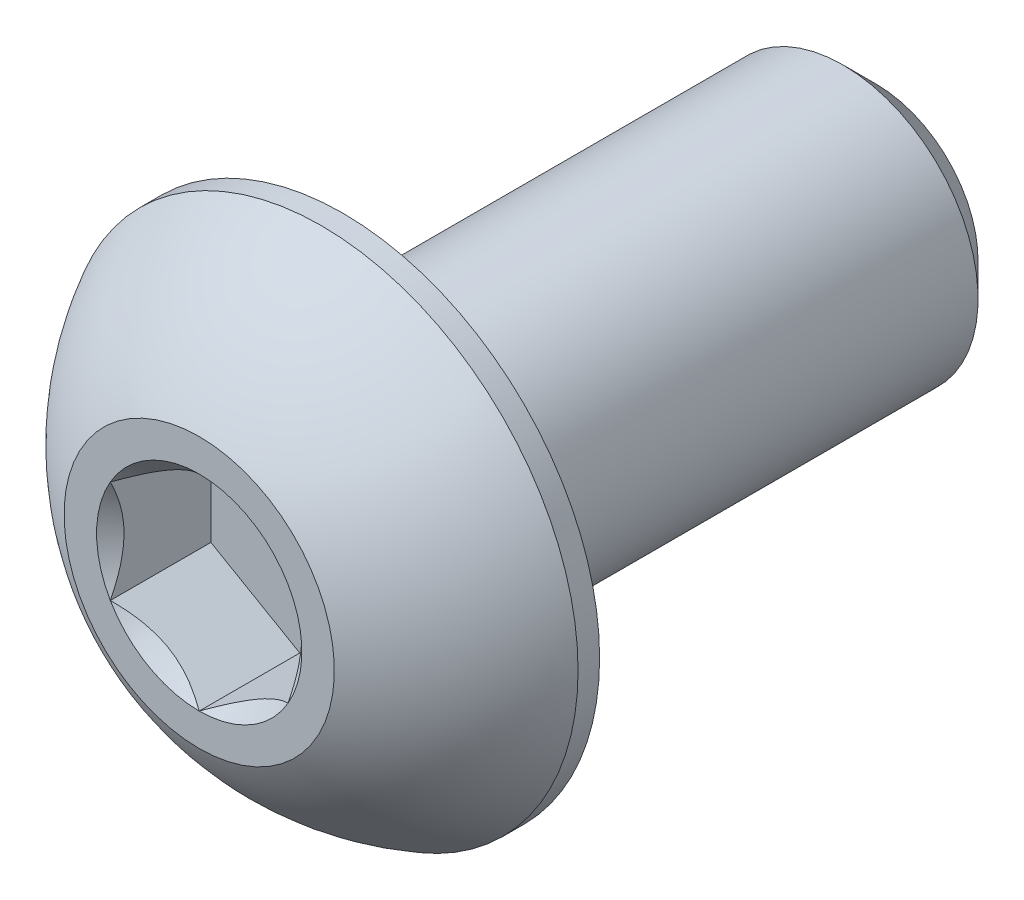
ISO-10303-21;
HEADER;
FILE_DESCRIPTION(('STEP AP214'),'2;1');
FILE_NAME('part.step','',(''),(''),'','','');
FILE_SCHEMA(('AUTOMOTIVE_DESIGN { 1 0 10303 214 1 1 1 1 }'));
ENDSEC;
DATA;
#1=APPLICATION_CONTEXT('core data for automotive mechanical design processes');
#2=APPLICATION_PROTOCOL_DEFINITION('international standard','automotive_design',2000,#1);
#3=PRODUCT_CONTEXT('',#1,'mechanical');
#4=PRODUCT('Part','Part','',(#3));
#5=PRODUCT_RELATED_PRODUCT_CATEGORY('part','',(#4));
#6=PRODUCT_DEFINITION_FORMATION('','',#4);
#7=PRODUCT_DEFINITION_CONTEXT('part definition',#1,'design');
#8=PRODUCT_DEFINITION('design','',#6,#7);
#9=PRODUCT_DEFINITION_SHAPE('','',#8);
#10=(LENGTH_UNIT() NAMED_UNIT(*) SI_UNIT(.MILLI.,.METRE.));
#11=(NAMED_UNIT(*) PLANE_ANGLE_UNIT() SI_UNIT($,.RADIAN.));
#12=(NAMED_UNIT(*) SI_UNIT($,.STERADIAN.) SOLID_ANGLE_UNIT());
#13=UNCERTAINTY_MEASURE_WITH_UNIT(LENGTH_MEASURE(1.E-05),#10,'distance_accuracy_value','');
#14=(GEOMETRIC_REPRESENTATION_CONTEXT(3) GLOBAL_UNCERTAINTY_ASSIGNED_CONTEXT((#13)) GLOBAL_UNIT_ASSIGNED_CONTEXT((#10,
#11,#12)) REPRESENTATION_CONTEXT('',''));
#15=CARTESIAN_POINT('',(0.,0.,0.));
#16=DIRECTION('',(0.,0.,1.));
#17=DIRECTION('',(1.,0.,0.));
#18=AXIS2_PLACEMENT_3D('',#15,#16,#17);
#19=CARTESIAN_POINT('',(0.,-2.41300000000001,-12.0904));
#20=DIRECTION('',(0.,0.,-1.));
#21=DIRECTION('',(0.,1.,0.));
#22=AXIS2_PLACEMENT_3D('',#19,#20,#21);
#23=PLANE('',#22);
#24=CARTESIAN_POINT('',(0.,0.,-12.0904));
#25=DIRECTION('',(0.,0.,-1.));
#26=DIRECTION('',(0.,1.,0.));
#27=AXIS2_PLACEMENT_3D('',#24,#25,#26);
#28=CIRCLE('',#27,1.8176875);
#29=CARTESIAN_POINT('',(0.,1.8176875,-12.0904));
#30=VERTEX_POINT('',#29);
#31=EDGE_CURVE('E46',#30,#30,#28,.T.);
#32=ORIENTED_EDGE('',*,*,#31,.T.);
#33=EDGE_LOOP('',(#32));
#34=FACE_BOUND('',#33,.T.);
#35=ADVANCED_FACE('F38',(#34),#23,.T.);
#36=CARTESIAN_POINT('',(0.,0.,-12.0904));
#37=DIRECTION('',(0.,0.,-1.));
#38=DIRECTION('',(0.,1.,0.));
#39=AXIS2_PLACEMENT_3D('',#36,#37,#38);
#40=CYLINDRICAL_SURFACE('',#39,2.413);
#41=CARTESIAN_POINT('',(0.,0.,-11.4950875));
#42=DIRECTION('',(0.,0.,-1.));
#43=DIRECTION('',(0.,1.,0.));
#44=AXIS2_PLACEMENT_3D('',#41,#42,#43);
#45=CIRCLE('',#44,2.413);
#46=CARTESIAN_POINT('',(0.,2.413,-11.4950875));
#47=VERTEX_POINT('',#46);
#48=EDGE_CURVE('E11',#47,#47,#45,.F.);
#49=ORIENTED_EDGE('',*,*,#48,.T.);
#50=EDGE_LOOP('',(#49));
#51=FACE_BOUND('',#50,.T.);
#52=CARTESIAN_POINT('',(0.,0.,-2.5654));
#53=DIRECTION('',(0.,0.,1.));
#54=DIRECTION('',(1.,0.,0.));
#55=AXIS2_PLACEMENT_3D('',#52,#53,#54);
#56=CIRCLE('',#55,2.413);
#57=CARTESIAN_POINT('',(2.413,0.,-2.5654));
#58=VERTEX_POINT('',#57);
#59=EDGE_CURVE('E172',#58,#58,#56,.F.);
#60=ORIENTED_EDGE('',*,*,#59,.T.);
#61=EDGE_LOOP('',(#60));
#62=FACE_BOUND('',#61,.T.);
#63=ADVANCED_FACE('F180',(#51,#62),#40,.T.);
#64=CARTESIAN_POINT('',(0.,0.,-12.0904));
#65=DIRECTION('',(0.,0.,1.));
#66=DIRECTION('',(0.,-1.,0.));
#67=AXIS2_PLACEMENT_3D('',#64,#65,#66);
#68=CONICAL_SURFACE('',#67,1.8176875,0.785398163397449);
#69=ORIENTED_EDGE('',*,*,#48,.F.);
#70=EDGE_LOOP('',(#69));
#71=FACE_BOUND('',#70,.T.);
#72=ORIENTED_EDGE('',*,*,#31,.F.);
#73=EDGE_LOOP('',(#72));
#74=FACE_BOUND('',#73,.T.);
#75=ADVANCED_FACE('F40',(#71,#74),#68,.T.);
#76=CARTESIAN_POINT('',(0.,0.,-4.5748806144438));
#77=DIRECTION('',(0.,0.,1.));
#78=DIRECTION('',(0.,-1.,0.));
#79=AXIS2_PLACEMENT_3D('',#76,#77,#78);
#80=SPHERICAL_SURFACE('',#79,5.17224338526463);
#81=CARTESIAN_POINT('',(0.,0.,0.));
#82=DIRECTION('',(0.,0.,1.));
#83=DIRECTION('',(1.,0.,0.));
#84=AXIS2_PLACEMENT_3D('',#81,#82,#83);
#85=CIRCLE('',#84,2.413);
#86=CARTESIAN_POINT('',(0.,-2.413,0.));
#87=VERTEX_POINT('',#86);
#88=EDGE_CURVE('E169',#87,#87,#85,.T.);
#89=CARTESIAN_POINT('',(0.,0.,-2.18059));
#90=DIRECTION('',(0.,0.,1.));
#91=DIRECTION('',(1.,0.,0.));
#92=AXIS2_PLACEMENT_3D('',#89,#90,#91);
#93=CIRCLE('',#92,4.5847);
#94=CARTESIAN_POINT('',(0.,-4.5847,-2.18059));
#95=VERTEX_POINT('',#94);
#96=EDGE_CURVE('E163',#95,#95,#93,.T.);
#97=CARTESIAN_POINT('',(0.,-2.413,0.));
#98=CARTESIAN_POINT('',(0.,-2.44179113663083,-0.0151857097788009));
#99=CARTESIAN_POINT('',(0.,-2.47043888331474,-0.0306432741933343));
#100=CARTESIAN_POINT('',(0.,-2.5274374690351,-0.0620964513369402));
#101=CARTESIAN_POINT('',(0.,-2.55578830807155,-0.0780920640660127));
#102=CARTESIAN_POINT('',(0.,-2.61218295074331,-0.110615676881771));
#103=CARTESIAN_POINT('',(0.,-2.64022675437863,-0.127143676968457));
#104=CARTESIAN_POINT('',(0.,-2.69599733629138,-0.160726162390165));
#105=CARTESIAN_POINT('',(0.,-2.72372411456882,-0.177780647725188));
#106=CARTESIAN_POINT('',(0.,-2.77885076121154,-0.21241002764294));
#107=CARTESIAN_POINT('',(0.,-2.80625062957682,-0.229984922225668));
#108=CARTESIAN_POINT('',(0.,-2.86071369040082,-0.265648855453746));
#109=CARTESIAN_POINT('',(0.,-2.88777688285954,-0.283737894099096));
#110=CARTESIAN_POINT('',(0.,-2.94155694533546,-0.320423667994127));
#111=CARTESIAN_POINT('',(0.,-2.96827381535265,-0.339020403243808));
#112=CARTESIAN_POINT('',(0.,-3.02135171000009,-0.37671494166065));
#113=CARTESIAN_POINT('',(0.,-3.04771273463033,-0.39581274482781));
#114=CARTESIAN_POINT('',(0.,-3.10006954235699,-0.434502611862808));
#115=CARTESIAN_POINT('',(0.,-3.12606532545341,-0.454094675730644));
#116=CARTESIAN_POINT('',(0.,-3.17768238416296,-0.493766080756604));
#117=CARTESIAN_POINT('',(0.,-3.20330365977609,-0.513845421914727));
#118=CARTESIAN_POINT('',(0.,-3.25416257105645,-0.554484224430573));
#119=CARTESIAN_POINT('',(0.,-3.27940020672367,-0.575043685788297));
#120=CARTESIAN_POINT('',(0.,-3.32948284239517,-0.616635400476975));
#121=CARTESIAN_POINT('',(0.,-3.35432784239946,-0.63766765380793));
#122=CARTESIAN_POINT('',(0.,-3.40361635097913,-0.680197455694829));
#123=CARTESIAN_POINT('',(0.,-3.42805985955453,-0.701695004250773));
#124=CARTESIAN_POINT('',(0.,-3.47653667261836,-0.745147733989217));
#125=CARTESIAN_POINT('',(0.,-3.5005699771068,-0.767102915171716));
#126=CARTESIAN_POINT('',(0.,-3.54821781555203,-0.81146308444603));
#127=CARTESIAN_POINT('',(0.,-3.57183234950881,-0.833868072537843));
#128=CARTESIAN_POINT('',(0.,-3.61863422971284,-0.879119869584105));
#129=CARTESIAN_POINT('',(0.,-3.64182157596008,-0.901966678538555));
#130=CARTESIAN_POINT('',(0.,-3.68776081583415,-0.948093973780533));
#131=CARTESIAN_POINT('',(0.,-3.71051270946098,-0.971374460068061));
#132=CARTESIAN_POINT('',(0.,-3.75557293439636,-1.01836081186645));
#133=CARTESIAN_POINT('',(0.,-3.7778812657049,-1.0420666773773));
#134=CARTESIAN_POINT('',(0.,-3.82204641440941,-1.08989533789018));
#135=CARTESIAN_POINT('',(0.,-3.84390323180538,-1.11401813289221));
#136=CARTESIAN_POINT('',(0.,-3.88715756202836,-1.16267205404467));
#137=CARTESIAN_POINT('',(0.,-3.90855507485536,-1.18720318019511));
#138=CARTESIAN_POINT('',(0.,-3.95088316899876,-1.23666501975588));
#139=CARTESIAN_POINT('',(0.,-3.97181375031515,-1.26159573316622));
#140=CARTESIAN_POINT('',(0.,-4.01320052092912,-1.31184786092909));
#141=CARTESIAN_POINT('',(0.,-4.03365671022669,-1.33716927528163));
#142=CARTESIAN_POINT('',(0.,-4.07408740538699,-1.38819377934977));
#143=CARTESIAN_POINT('',(0.,-4.09406191124973,-1.41389686906536));
#144=CARTESIAN_POINT('',(0.,-4.13352211981722,-1.46567556223513));
#145=CARTESIAN_POINT('',(0.,-4.15300782252198,-1.4917511656893));
#146=CARTESIAN_POINT('',(0.,-4.19148347927457,-1.54426559193551));
#147=CARTESIAN_POINT('',(0.,-4.2104734333224,-1.57070441472756));
#148=CARTESIAN_POINT('',(0.,-4.24795082398615,-1.6239358557723));
#149=CARTESIAN_POINT('',(0.,-4.26643826060207,-1.65072847402499));
#150=CARTESIAN_POINT('',(0.,-4.3029040266735,-1.70465795604563));
#151=CARTESIAN_POINT('',(0.,-4.32088235612901,-1.73179481981358));
#152=CARTESIAN_POINT('',(0.,-4.35632349988304,-1.78640312007115));
#153=CARTESIAN_POINT('',(0.,-4.37378631418156,-1.81387455656079));
#154=CARTESIAN_POINT('',(0.,-4.40819020238474,-1.86914221075438));
#155=CARTESIAN_POINT('',(0.,-4.42513127628939,-1.89693842845834));
#156=CARTESIAN_POINT('',(0.,-4.45848564813517,-1.95284573578717));
#157=CARTESIAN_POINT('',(0.,-4.4748989460763,-1.98095682541204));
#158=CARTESIAN_POINT('',(0.,-4.50719190474587,-2.03748386259807));
#159=CARTESIAN_POINT('',(0.,-4.5230715654743,-2.06589981015923));
#160=CARTESIAN_POINT('',(0.,-4.55429163018258,-2.12302641242262));
#161=CARTESIAN_POINT('',(0.,-4.56963203416241,-2.15173706712485));
#162=CARTESIAN_POINT('',(0.,-4.5847,-2.18059));
#163=B_SPLINE_CURVE_WITH_KNOTS('',3,(#97,#98,#99,#100,#101,#102,#103,#104,#105,#106,#107,#108,
#109,#110,#111,#112,#113,#114,#115,#116,#117,#118,#119,#120,#121,#122,#123,#124,#125,#126,#127,
#128,#129,#130,#131,#132,#133,#134,#135,#136,#137,#138,#139,#140,#141,#142,#143,#144,#145,#146,
#147,#148,#149,#150,#151,#152,#153,#154,#155,#156,#157,#158,#159,#160,#161,#162),.UNSPECIFIED.,
.F.,.F.,(4,2,2,2,2,2,2,2,2,2,2,2,2,2,2,2,2,2,2,2,2,2,2,2,2,2,2,2,2,2,2,2,4),(0.,
0.0976500604051489,0.195300120810298,0.292950181215447,0.390600241620598,0.488250302025747,
0.585900362430896,0.683550422836046,0.781200483241194,0.878850543646344,0.976500604051493,
1.07415066445664,1.17180072486179,1.26945078526694,1.36710084567209,1.46475090607724,
1.56240096648239,1.66005102688754,1.75770108729269,1.85535114769784,1.95300120810299,
2.05065126850814,2.14830132891329,2.24595138931843,2.34360144972358,2.44125151012873,
2.53890157053388,2.63655163093903,2.73420169134418,2.83185175174933,2.92950181215448,
3.02715187255963,3.12480193296478),.UNSPECIFIED.);
#164=EDGE_CURVE('BSEAM179',#87,#95,#163,.T.);
#165=ORIENTED_EDGE('',*,*,#88,.F.);
#166=ORIENTED_EDGE('',*,*,#96,.T.);
#167=ORIENTED_EDGE('',*,*,#164,.T.);
#168=ORIENTED_EDGE('',*,*,#164,.F.);
#169=EDGE_LOOP('',(#165,#167,#166,#168));
#170=FACE_BOUND('',#169,.T.);
#171=ADVANCED_FACE('F179',(#170),#80,.T.);
#172=CARTESIAN_POINT('',(0.,-2.413,0.));
#173=DIRECTION('',(0.,0.,-1.));
#174=DIRECTION('',(-1.,0.,0.));
#175=AXIS2_PLACEMENT_3D('',#172,#173,#174);
#176=PLANE('',#175);
#177=CARTESIAN_POINT('',(0.,0.,0.));
#178=DIRECTION('',(0.,0.,1.));
#179=DIRECTION('',(1.,0.,0.));
#180=AXIS2_PLACEMENT_3D('',#177,#178,#179);
#181=CIRCLE('',#180,1.83308710467706);
#182=CARTESIAN_POINT('',(-1.5875,0.916543552338531,0.));
#183=VERTEX_POINT('',#182);
#184=CARTESIAN_POINT('',(-1.5875,-0.916543552338532,0.));
#185=VERTEX_POINT('',#184);
#186=EDGE_CURVE('E59',#183,#185,#181,.T.);
#187=ORIENTED_EDGE('',*,*,#186,.F.);
#188=CARTESIAN_POINT('',(0.,1.83308710467706,0.));
#189=VERTEX_POINT('',#188);
#190=EDGE_CURVE('E133',#189,#183,#181,.T.);
#191=ORIENTED_EDGE('',*,*,#190,.F.);
#192=CARTESIAN_POINT('',(1.5875,0.916543552338531,0.));
#193=VERTEX_POINT('',#192);
#194=EDGE_CURVE('E110',#193,#189,#181,.T.);
#195=ORIENTED_EDGE('',*,*,#194,.F.);
#196=CARTESIAN_POINT('',(1.5875,-0.916543552338531,0.));
#197=VERTEX_POINT('',#196);
#198=EDGE_CURVE('E99',#197,#193,#181,.T.);
#199=ORIENTED_EDGE('',*,*,#198,.F.);
#200=CARTESIAN_POINT('',(0.,-1.83308710467706,0.));
#201=VERTEX_POINT('',#200);
#202=EDGE_CURVE('E91',#201,#197,#181,.T.);
#203=ORIENTED_EDGE('',*,*,#202,.F.);
#204=EDGE_CURVE('E52',#185,#201,#181,.T.);
#205=ORIENTED_EDGE('',*,*,#204,.F.);
#206=EDGE_LOOP('',(#187,#191,#195,#199,#203,#205));
#207=FACE_BOUND('',#206,.T.);
#208=ORIENTED_EDGE('',*,*,#88,.T.);
#209=EDGE_LOOP('',(#208));
#210=FACE_BOUND('',#209,.T.);
#211=ADVANCED_FACE('F130',(#207,#210),#176,.F.);
#212=CARTESIAN_POINT('',(0.,-4.5847,-2.5654));
#213=DIRECTION('',(0.,0.,1.));
#214=DIRECTION('',(1.,0.,0.));
#215=AXIS2_PLACEMENT_3D('',#212,#213,#214);
#216=PLANE('',#215);
#217=ORIENTED_EDGE('',*,*,#59,.F.);
#218=EDGE_LOOP('',(#217));
#219=FACE_BOUND('',#218,.T.);
#220=CARTESIAN_POINT('',(0.,0.,-2.5654));
#221=DIRECTION('',(0.,0.,1.));
#222=DIRECTION('',(1.,0.,0.));
#223=AXIS2_PLACEMENT_3D('',#220,#221,#222);
#224=CIRCLE('',#223,4.5847);
#225=CARTESIAN_POINT('',(4.5847,0.,-2.5654));
#226=VERTEX_POINT('',#225);
#227=EDGE_CURVE('E166',#226,#226,#224,.T.);
#228=ORIENTED_EDGE('',*,*,#227,.F.);
#229=EDGE_LOOP('',(#228));
#230=FACE_BOUND('',#229,.T.);
#231=ADVANCED_FACE('F197',(#219,#230),#216,.F.);
#232=CARTESIAN_POINT('',(0.,0.,0.));
#233=DIRECTION('',(0.,0.,1.));
#234=DIRECTION('',(1.,0.,0.));
#235=AXIS2_PLACEMENT_3D('',#232,#233,#234);
#236=CYLINDRICAL_SURFACE('',#235,4.5847);
#237=ORIENTED_EDGE('',*,*,#96,.F.);
#238=EDGE_LOOP('',(#237));
#239=FACE_BOUND('',#238,.T.);
#240=ORIENTED_EDGE('',*,*,#227,.T.);
#241=EDGE_LOOP('',(#240));
#242=FACE_BOUND('',#241,.T.);
#243=ADVANCED_FACE('F200',(#239,#242),#236,.T.);
#244=CARTESIAN_POINT('',(0.,0.,0.));
#245=DIRECTION('',(0.,0.,1.));
#246=DIRECTION('',(1.,0.,0.));
#247=AXIS2_PLACEMENT_3D('',#244,#245,#246);
#248=CONICAL_SURFACE('',#247,1.83308710467706,0.78539816339745);
#249=ORIENTED_EDGE('',*,*,#198,.T.);
#250=CARTESIAN_POINT('',(1.5875,-1.83163614232864,0.590762562254563));
#251=CARTESIAN_POINT('',(1.5875,-1.78705354844902,0.557077854803239));
#252=CARTESIAN_POINT('',(1.5875,-1.74222294150554,0.523722329968626));
#253=CARTESIAN_POINT('',(1.5875,-1.65196486784504,0.457805675888284));
#254=CARTESIAN_POINT('',(1.5875,-1.60653725449664,0.425244747634467));
#255=CARTESIAN_POINT('',(1.5875,-1.46854281940082,0.328493449461235));
#256=CARTESIAN_POINT('',(1.5875,-1.37494211623385,0.265753264612857));
#257=CARTESIAN_POINT('',(1.5875,-1.17864136265694,0.142553151294644));
#258=CARTESIAN_POINT('',(1.5875,-1.07572731596385,0.0824303289226483));
#259=CARTESIAN_POINT('',(1.5875,-0.864754189558117,-0.0275706334490083));
#260=CARTESIAN_POINT('',(1.5875,-0.756714033301438,-0.0774833149376717));
#261=CARTESIAN_POINT('',(1.5875,-0.594580029688666,-0.138547963751185));
#262=CARTESIAN_POINT('',(1.5875,-0.542894373932897,-0.156067797502568));
#263=CARTESIAN_POINT('',(1.5875,-0.43827206291756,-0.186958420156953));
#264=CARTESIAN_POINT('',(1.5875,-0.3853353220534,-0.200328924255393));
#265=CARTESIAN_POINT('',(1.5875,-0.279413400734369,-0.222002681044568));
#266=CARTESIAN_POINT('',(1.5875,-0.226446313904206,-0.230392976800141));
#267=CARTESIAN_POINT('',(1.5875,-0.119941637592404,-0.241941911012322));
#268=CARTESIAN_POINT('',(1.5875,-0.066404148626323,-0.245101456366562));
#269=CARTESIAN_POINT('',(1.5875,0.0387581192420282,-0.245952982965122));
#270=CARTESIAN_POINT('',(1.5875,0.0903813815542163,-0.243840334608509));
#271=CARTESIAN_POINT('',(1.5875,0.19318730201683,-0.234695846678065));
#272=CARTESIAN_POINT('',(1.5875,0.244369916988517,-0.227663530460197));
#273=CARTESIAN_POINT('',(1.5875,0.346790527788956,-0.208944949355169));
#274=CARTESIAN_POINT('',(1.5875,0.398013804172139,-0.197179358640977));
#275=CARTESIAN_POINT('',(1.5875,0.499340680307277,-0.169620657149212));
#276=CARTESIAN_POINT('',(1.5875,0.549444372105894,-0.153827878801824));
#277=CARTESIAN_POINT('',(1.5875,0.707022639586408,-0.0982133790717419));
#278=CARTESIAN_POINT('',(1.5875,0.812258737570578,-0.0520647672653369));
#279=CARTESIAN_POINT('',(1.5875,1.01778869013701,0.0505458403808824));
#280=CARTESIAN_POINT('',(1.5875,1.11806310933257,0.107044855107553));
#281=CARTESIAN_POINT('',(1.5875,1.30970442577157,0.223612502972616));
#282=CARTESIAN_POINT('',(1.5875,1.40126637149297,0.283364441978613));
#283=CARTESIAN_POINT('',(1.5875,1.53616443073865,0.37573700869171));
#284=CARTESIAN_POINT('',(1.5875,1.58054835823549,0.406854014274728));
#285=CARTESIAN_POINT('',(1.5875,1.66870952512132,0.469911550181166));
#286=CARTESIAN_POINT('',(1.5875,1.71248692801697,0.501851851647461));
#287=CARTESIAN_POINT('',(1.5875,1.75601179240957,0.53413355784713));
#288=B_SPLINE_CURVE_WITH_KNOTS('',3,(#250,#251,#252,#253,#254,#255,#256,#257,#258,#259,#260,
#261,#262,#263,#264,#265,#266,#267,#268,#269,#270,#271,#272,#273,#274,#275,#276,#277,#278,#279,
#280,#281,#282,#283,#284,#285,#286,#287),.UNSPECIFIED.,.F.,.F.,(4,2,2,2,2,2,2,2,2,2,2,2,2,2,2,2,
2,2,4),(0.,0.167627505127548,0.335296980846479,0.673194674702937,1.0304700708717,
1.38651603079307,1.55010049300857,1.71369618096554,1.87434127467533,2.034958513124,
2.18971280484453,2.34448209207484,2.50196108385089,2.65942708049529,3.00314617711216,
3.34811949873714,3.67595792169729,3.83856722085481,4.00113179576279),.UNSPECIFIED.);
#289=EDGE_CURVE('E104',#197,#193,#288,.T.);
#290=ORIENTED_EDGE('',*,*,#289,.F.);
#291=EDGE_LOOP('',(#249,#290));
#292=FACE_BOUND('',#291,.T.);
#293=ADVANCED_FACE('F105',(#292),#248,.F.);
#294=ORIENTED_EDGE('',*,*,#194,.T.);
#295=CARTESIAN_POINT('',(1.5877,0.916428082284693,0.000115480963706747));
#296=CARTESIAN_POINT('',(1.53312479190086,0.947937093371809,-0.0313691916294031));
#297=CARTESIAN_POINT('',(1.47763696320971,0.979973006203395,-0.06100495398647));
#298=CARTESIAN_POINT('',(1.36449087915364,1.04529792829092,-0.115267739979175));
#299=CARTESIAN_POINT('',(1.30682185887062,1.07859315267522,-0.139864564866823));
#300=CARTESIAN_POINT('',(1.1905349781269,1.14573141457583,-0.181999635727418));
#301=CARTESIAN_POINT('',(1.13194674474407,1.17955734689075,-0.199643807270178));
#302=CARTESIAN_POINT('',(1.01348022674557,1.24795402294714,-0.226828529915031));
#303=CARTESIAN_POINT('',(0.953605562983895,1.28252267618758,-0.236389379304923));
#304=CARTESIAN_POINT('',(0.850418771876558,1.34209759781022,-0.245015586895992));
#305=CARTESIAN_POINT('',(0.807240015952288,1.36702686416637,-0.246292807190424));
#306=CARTESIAN_POINT('',(0.720953038535399,1.41684467380557,-0.244142944185295));
#307=CARTESIAN_POINT('',(0.677844847078612,1.44173319974742,-0.240714211450657));
#308=CARTESIAN_POINT('',(0.592046335002031,1.49126899379091,-0.229349005566657));
#309=CARTESIAN_POINT('',(0.549356408925407,1.51591603410293,-0.221408628198358));
#310=CARTESIAN_POINT('',(0.464693063478359,1.56479643938728,-0.201451585548899));
#311=CARTESIAN_POINT('',(0.422719959755075,1.58902962212064,-0.189433170791309));
#312=CARTESIAN_POINT('',(0.315211458113567,1.65109968448354,-0.153753102752754));
#313=CARTESIAN_POINT('',(0.2503427717089,1.68855163804125,-0.127401427696863));
#314=CARTESIAN_POINT('',(0.154961599380924,1.74361998356043,-0.082916463148298));
#315=CARTESIAN_POINT('',(0.123530699536157,1.76176662204668,-0.0672871421988685));
#316=CARTESIAN_POINT('',(0.0612469855696369,1.79772614107138,-0.0346015121388986));
#317=CARTESIAN_POINT('',(0.0303939039605764,1.8155391760437,-0.0175458843430301));
#318=CARTESIAN_POINT('',(-0.000200000000000335,1.8332025747309,0.000115480963706747));
#319=B_SPLINE_CURVE_WITH_KNOTS('',3,(#295,#296,#297,#298,#299,#300,#301,#302,#303,#304,#305,
#306,#307,#308,#309,#310,#311,#312,#313,#314,#315,#316,#317,#318),.UNSPECIFIED.,.F.,.F.,(4,2,2,
2,2,2,2,2,2,2,2,4),(0.,0.211482650810816,0.424197870807276,0.633533884524815,0.842342653263347,
0.99175555372714,1.14122083674204,1.29081565918877,1.44047473906437,1.6781878086972,
1.79671410024894,1.91518409436631),.UNSPECIFIED.);
#320=EDGE_CURVE('E109',#193,#189,#319,.T.);
#321=ORIENTED_EDGE('',*,*,#320,.F.);
#322=EDGE_LOOP('',(#294,#321));
#323=FACE_BOUND('',#322,.T.);
#324=ADVANCED_FACE('F291',(#323),#248,.F.);
#325=ORIENTED_EDGE('',*,*,#190,.T.);
#326=CARTESIAN_POINT('',(0.000199999999999625,1.8332025747309,0.000115480963706835));
#327=CARTESIAN_POINT('',(-0.0543752080991368,1.80169356364378,-0.0313691916294032));
#328=CARTESIAN_POINT('',(-0.10986303679029,1.7696576508122,-0.0610049539864701));
#329=CARTESIAN_POINT('',(-0.223009120846359,1.70433272872467,-0.115267739979175));
#330=CARTESIAN_POINT('',(-0.280678141129381,1.67103750434037,-0.139864564866824));
#331=CARTESIAN_POINT('',(-0.396965021873104,1.60389924243976,-0.181999635727418));
#332=CARTESIAN_POINT('',(-0.455553255255932,1.57007331012484,-0.199643807270178));
#333=CARTESIAN_POINT('',(-0.574019773254431,1.50167663406845,-0.226828529915031));
#334=CARTESIAN_POINT('',(-0.633894437016106,1.46710798082801,-0.236389379304923));
#335=CARTESIAN_POINT('',(-0.737081228123443,1.40753305920537,-0.245015586895992));
#336=CARTESIAN_POINT('',(-0.780259984047713,1.38260379284922,-0.246292807190424));
#337=CARTESIAN_POINT('',(-0.866546961464602,1.33278598321002,-0.244142944185296));
#338=CARTESIAN_POINT('',(-0.909655152921389,1.30789745726817,-0.240714211450657));
#339=CARTESIAN_POINT('',(-0.99545366499797,1.25836166322468,-0.229349005566656));
#340=CARTESIAN_POINT('',(-1.03814359107459,1.23371462291266,-0.221408628198358));
#341=CARTESIAN_POINT('',(-1.12280693652164,1.18483421762831,-0.201451585548899));
#342=CARTESIAN_POINT('',(-1.16478004024493,1.16060103489495,-0.189433170791309));
#343=CARTESIAN_POINT('',(-1.27228854188643,1.09853097253205,-0.153753102752754));
#344=CARTESIAN_POINT('',(-1.3371572282911,1.06107901897434,-0.127401427696863));
#345=CARTESIAN_POINT('',(-1.43253840061908,1.00601067345516,-0.0829164631482982));
#346=CARTESIAN_POINT('',(-1.46396930046384,0.987864034968913,-0.0672871421988688));
#347=CARTESIAN_POINT('',(-1.52625301443036,0.951904515944214,-0.0346015121388989));
#348=CARTESIAN_POINT('',(-1.55710609603942,0.934091480971893,-0.0175458843430305));
#349=CARTESIAN_POINT('',(-1.5877,0.916428082284693,0.000115480963706338));
#350=B_SPLINE_CURVE_WITH_KNOTS('',3,(#326,#327,#328,#329,#330,#331,#332,#333,#334,#335,#336,
#337,#338,#339,#340,#341,#342,#343,#344,#345,#346,#347,#348,#349),.UNSPECIFIED.,.F.,.F.,(4,2,2,
2,2,2,2,2,2,2,2,4),(0.,0.211482650810816,0.424197870807276,0.633533884524816,0.842342653263349,
0.991755553727142,1.14122083674205,1.29081565918877,1.44047473906438,1.6781878086972,
1.79671410024894,1.91518409436631),.UNSPECIFIED.);
#351=EDGE_CURVE('E140',#189,#183,#350,.T.);
#352=ORIENTED_EDGE('',*,*,#351,.F.);
#353=EDGE_LOOP('',(#325,#352));
#354=FACE_BOUND('',#353,.T.);
#355=ADVANCED_FACE('F138',(#354),#248,.F.);
#356=ORIENTED_EDGE('',*,*,#186,.T.);
#357=CARTESIAN_POINT('',(-1.5875,-1.83163614232865,0.590762562254564));
#358=CARTESIAN_POINT('',(-1.5875,-1.78705354844902,0.55707785480324));
#359=CARTESIAN_POINT('',(-1.5875,-1.74222294150555,0.523722329968627));
#360=CARTESIAN_POINT('',(-1.5875,-1.65196486784504,0.457805675888285));
#361=CARTESIAN_POINT('',(-1.5875,-1.60653725449665,0.425244747634468));
#362=CARTESIAN_POINT('',(-1.5875,-1.46854281940082,0.328493449461235));
#363=CARTESIAN_POINT('',(-1.5875,-1.37494211623386,0.265753264612857));
#364=CARTESIAN_POINT('',(-1.5875,-1.17864136265695,0.142553151294644));
#365=CARTESIAN_POINT('',(-1.5875,-1.07572731596385,0.0824303289226481));
#366=CARTESIAN_POINT('',(-1.5875,-0.864754189558117,-0.0275706334490085));
#367=CARTESIAN_POINT('',(-1.5875,-0.756714033301438,-0.0774833149376719));
#368=CARTESIAN_POINT('',(-1.5875,-0.594580029688666,-0.138547963751186));
#369=CARTESIAN_POINT('',(-1.5875,-0.542894373932898,-0.156067797502569));
#370=CARTESIAN_POINT('',(-1.5875,-0.43827206291756,-0.186958420156954));
#371=CARTESIAN_POINT('',(-1.5875,-0.3853353220534,-0.200328924255393));
#372=CARTESIAN_POINT('',(-1.5875,-0.27941340073437,-0.222002681044568));
#373=CARTESIAN_POINT('',(-1.5875,-0.226446313904207,-0.230392976800141));
#374=CARTESIAN_POINT('',(-1.5875,-0.119941637592404,-0.241941911012323));
#375=CARTESIAN_POINT('',(-1.5875,-0.0664041486263238,-0.245101456366563));
#376=CARTESIAN_POINT('',(-1.5875,0.0387581192420274,-0.245952982965122));
#377=CARTESIAN_POINT('',(-1.5875,0.0903813815542155,-0.24384033460851));
#378=CARTESIAN_POINT('',(-1.5875,0.193187302016829,-0.234695846678065));
#379=CARTESIAN_POINT('',(-1.5875,0.244369916988516,-0.227663530460198));
#380=CARTESIAN_POINT('',(-1.5875,0.346790527788956,-0.208944949355169));
#381=CARTESIAN_POINT('',(-1.5875,0.398013804172139,-0.197179358640978));
#382=CARTESIAN_POINT('',(-1.5875,0.499340680307276,-0.169620657149213));
#383=CARTESIAN_POINT('',(-1.5875,0.549444372105894,-0.153827878801825));
#384=CARTESIAN_POINT('',(-1.5875,0.707022639586407,-0.0982133790717423));
#385=CARTESIAN_POINT('',(-1.5875,0.812258737570578,-0.0520647672653373));
#386=CARTESIAN_POINT('',(-1.5875,1.01778869013701,0.0505458403808818));
#387=CARTESIAN_POINT('',(-1.5875,1.11806310933256,0.107044855107552));
#388=CARTESIAN_POINT('',(-1.5875,1.30970442577157,0.223612502972616));
#389=CARTESIAN_POINT('',(-1.5875,1.40126637149297,0.283364441978612));
#390=CARTESIAN_POINT('',(-1.5875,1.53616443073864,0.375737008691709));
#391=CARTESIAN_POINT('',(-1.5875,1.58054835823549,0.406854014274728));
#392=CARTESIAN_POINT('',(-1.5875,1.66870952512132,0.469911550181165));
#393=CARTESIAN_POINT('',(-1.5875,1.71248692801697,0.501851851647461));
#394=CARTESIAN_POINT('',(-1.5875,1.75601179240957,0.53413355784713));
#395=B_SPLINE_CURVE_WITH_KNOTS('',3,(#357,#358,#359,#360,#361,#362,#363,#364,#365,#366,#367,
#368,#369,#370,#371,#372,#373,#374,#375,#376,#377,#378,#379,#380,#381,#382,#383,#384,#385,#386,
#387,#388,#389,#390,#391,#392,#393,#394),.UNSPECIFIED.,.F.,.F.,(4,2,2,2,2,2,2,2,2,2,2,2,2,2,2,2,
2,2,4),(0.,0.167627505127548,0.33529698084648,0.673194674702938,1.0304700708717,
1.38651603079307,1.55010049300858,1.71369618096554,1.87434127467533,2.034958513124,
2.18971280484453,2.34448209207484,2.50196108385089,2.65942708049529,3.00314617711216,
3.34811949873714,3.6759579216973,3.83856722085481,4.00113179576279),.UNSPECIFIED.);
#396=EDGE_CURVE('E144',#183,#185,#395,.F.);
#397=ORIENTED_EDGE('',*,*,#396,.F.);
#398=EDGE_LOOP('',(#356,#397));
#399=FACE_BOUND('',#398,.T.);
#400=ADVANCED_FACE('F285',(#399),#248,.F.);
#401=ORIENTED_EDGE('',*,*,#204,.T.);
#402=CARTESIAN_POINT('',(-1.5877,-0.916428082284693,0.000115480963706314));
#403=CARTESIAN_POINT('',(-1.53312479190086,-0.947937093371809,-0.0313691916294034));
#404=CARTESIAN_POINT('',(-1.47763696320971,-0.979973006203395,-0.0610049539864703));
#405=CARTESIAN_POINT('',(-1.36449087915364,-1.04529792829092,-0.115267739979175));
#406=CARTESIAN_POINT('',(-1.30682185887062,-1.07859315267522,-0.139864564866824));
#407=CARTESIAN_POINT('',(-1.1905349781269,-1.14573141457583,-0.181999635727418));
#408=CARTESIAN_POINT('',(-1.13194674474407,-1.17955734689075,-0.199643807270178));
#409=CARTESIAN_POINT('',(-1.01348022674557,-1.24795402294714,-0.226828529915031));
#410=CARTESIAN_POINT('',(-0.953605562983895,-1.28252267618758,-0.236389379304923));
#411=CARTESIAN_POINT('',(-0.850418771876557,-1.34209759781022,-0.245015586895992));
#412=CARTESIAN_POINT('',(-0.807240015952288,-1.36702686416637,-0.246292807190424));
#413=CARTESIAN_POINT('',(-0.720953038535399,-1.41684467380557,-0.244142944185296));
#414=CARTESIAN_POINT('',(-0.677844847078612,-1.44173319974742,-0.240714211450657));
#415=CARTESIAN_POINT('',(-0.592046335002031,-1.49126899379091,-0.229349005566657));
#416=CARTESIAN_POINT('',(-0.549356408925406,-1.51591603410293,-0.221408628198358));
#417=CARTESIAN_POINT('',(-0.464693063478359,-1.56479643938728,-0.201451585548899));
#418=CARTESIAN_POINT('',(-0.422719959755075,-1.58902962212064,-0.189433170791309));
#419=CARTESIAN_POINT('',(-0.315211458113566,-1.65109968448354,-0.153753102752754));
#420=CARTESIAN_POINT('',(-0.2503427717089,-1.68855163804125,-0.127401427696864));
#421=CARTESIAN_POINT('',(-0.154961599380924,-1.74361998356043,-0.0829164631482981));
#422=CARTESIAN_POINT('',(-0.123530699536157,-1.76176662204668,-0.0672871421988687));
#423=CARTESIAN_POINT('',(-0.0612469855696368,-1.79772614107138,-0.0346015121388988));
#424=CARTESIAN_POINT('',(-0.0303939039605762,-1.8155391760437,-0.0175458843430303));
#425=CARTESIAN_POINT('',(0.000200000000000577,-1.8332025747309,0.000115480963706654));
#426=B_SPLINE_CURVE_WITH_KNOTS('',3,(#402,#403,#404,#405,#406,#407,#408,#409,#410,#411,#412,
#413,#414,#415,#416,#417,#418,#419,#420,#421,#422,#423,#424,#425),.UNSPECIFIED.,.F.,.F.,(4,2,2,
2,2,2,2,2,2,2,2,4),(0.,0.211482650810816,0.424197870807276,0.633533884524815,0.842342653263347,
0.99175555372714,1.14122083674204,1.29081565918877,1.44047473906437,1.6781878086972,
1.79671410024894,1.91518409436631),.UNSPECIFIED.);
#427=EDGE_CURVE('E120',#185,#201,#426,.T.);
#428=ORIENTED_EDGE('',*,*,#427,.F.);
#429=EDGE_LOOP('',(#401,#428));
#430=FACE_BOUND('',#429,.T.);
#431=ADVANCED_FACE('F229',(#430),#248,.F.);
#432=ORIENTED_EDGE('',*,*,#202,.T.);
#433=CARTESIAN_POINT('',(-0.000199999999999235,-1.8332025747309,0.000115480963706835));
#434=CARTESIAN_POINT('',(0.0543752080991371,-1.80169356364378,-0.0313691916294032));
#435=CARTESIAN_POINT('',(0.109863036790291,-1.7696576508122,-0.0610049539864701));
#436=CARTESIAN_POINT('',(0.223009120846359,-1.70433272872467,-0.115267739979175));
#437=CARTESIAN_POINT('',(0.280678141129382,-1.67103750434037,-0.139864564866824));
#438=CARTESIAN_POINT('',(0.396965021873104,-1.60389924243976,-0.181999635727418));
#439=CARTESIAN_POINT('',(0.455553255255931,-1.57007331012484,-0.199643807270178));
#440=CARTESIAN_POINT('',(0.574019773254431,-1.50167663406845,-0.226828529915031));
#441=CARTESIAN_POINT('',(0.633894437016105,-1.46710798082801,-0.236389379304923));
#442=CARTESIAN_POINT('',(0.737081228123443,-1.40753305920537,-0.245015586895992));
#443=CARTESIAN_POINT('',(0.780259984047712,-1.38260379284922,-0.246292807190424));
#444=CARTESIAN_POINT('',(0.866546961464601,-1.33278598321002,-0.244142944185295));
#445=CARTESIAN_POINT('',(0.909655152921388,-1.30789745726817,-0.240714211450657));
#446=CARTESIAN_POINT('',(0.995453664997969,-1.25836166322468,-0.229349005566657));
#447=CARTESIAN_POINT('',(1.03814359107459,-1.23371462291266,-0.221408628198358));
#448=CARTESIAN_POINT('',(1.12280693652164,-1.18483421762831,-0.201451585548899));
#449=CARTESIAN_POINT('',(1.16478004024493,-1.16060103489495,-0.189433170791309));
#450=CARTESIAN_POINT('',(1.27228854188643,-1.09853097253205,-0.153753102752754));
#451=CARTESIAN_POINT('',(1.3371572282911,-1.06107901897434,-0.127401427696864));
#452=CARTESIAN_POINT('',(1.43253840061908,-1.00601067345516,-0.0829164631482982));
#453=CARTESIAN_POINT('',(1.46396930046384,-0.987864034968913,-0.0672871421988686));
#454=CARTESIAN_POINT('',(1.52625301443036,-0.951904515944214,-0.0346015121388986));
#455=CARTESIAN_POINT('',(1.55710609603942,-0.934091480971893,-0.0175458843430301));
#456=CARTESIAN_POINT('',(1.5877,-0.916428082284692,0.000115480963706545));
#457=B_SPLINE_CURVE_WITH_KNOTS('',3,(#433,#434,#435,#436,#437,#438,#439,#440,#441,#442,#443,
#444,#445,#446,#447,#448,#449,#450,#451,#452,#453,#454,#455,#456),.UNSPECIFIED.,.F.,.F.,(4,2,2,
2,2,2,2,2,2,2,2,4),(0.,0.211482650810817,0.424197870807276,0.633533884524815,0.842342653263348,
0.991755553727141,1.14122083674204,1.29081565918877,1.44047473906437,1.6781878086972,
1.79671410024894,1.91518409436631),.UNSPECIFIED.);
#458=EDGE_CURVE('E95',#201,#197,#457,.T.);
#459=ORIENTED_EDGE('',*,*,#458,.F.);
#460=EDGE_LOOP('',(#432,#459));
#461=FACE_BOUND('',#460,.T.);
#462=ADVANCED_FACE('F93',(#461),#248,.F.);
#463=CARTESIAN_POINT('',(1.5875,-0.91654355233853,-1.79578));
#464=DIRECTION('',(0.,0.,1.));
#465=DIRECTION('',(1.,0.,0.));
#466=AXIS2_PLACEMENT_3D('',#463,#464,#465);
#467=PLANE('',#466);
#468=DIRECTION('',(0.866025403784438,0.5,0.));
#469=VECTOR('',#468,1.);
#470=CARTESIAN_POINT('',(0.,-1.83308710467706,-1.79578));
#471=LINE('',#470,#469);
#472=CARTESIAN_POINT('',(0.,-1.83308710467706,-1.79578));
#473=VERTEX_POINT('',#472);
#474=CARTESIAN_POINT('',(1.5875,-0.91654355233853,-1.79578));
#475=VERTEX_POINT('',#474);
#476=EDGE_CURVE('E119',#473,#475,#471,.T.);
#477=ORIENTED_EDGE('',*,*,#476,.T.);
#478=DIRECTION('',(0.,1.,0.));
#479=VECTOR('',#478,1.);
#480=CARTESIAN_POINT('',(1.5875,-0.91654355233853,-1.79578));
#481=LINE('',#480,#479);
#482=CARTESIAN_POINT('',(1.5875,0.916543552338531,-1.79578));
#483=VERTEX_POINT('',#482);
#484=EDGE_CURVE('E124',#475,#483,#481,.T.);
#485=ORIENTED_EDGE('',*,*,#484,.T.);
#486=DIRECTION('',(-0.866025403784439,0.5,0.));
#487=VECTOR('',#486,1.);
#488=CARTESIAN_POINT('',(1.5875,0.916543552338531,-1.79578));
#489=LINE('',#488,#487);
#490=CARTESIAN_POINT('',(0.,1.83308710467706,-1.79578));
#491=VERTEX_POINT('',#490);
#492=EDGE_CURVE('E275',#483,#491,#489,.T.);
#493=ORIENTED_EDGE('',*,*,#492,.T.);
#494=DIRECTION('',(-0.866025403784439,-0.5,0.));
#495=VECTOR('',#494,1.);
#496=CARTESIAN_POINT('',(0.,1.83308710467706,-1.79578));
#497=LINE('',#496,#495);
#498=CARTESIAN_POINT('',(-1.5875,0.916543552338531,-1.79578));
#499=VERTEX_POINT('',#498);
#500=EDGE_CURVE('E154',#491,#499,#497,.T.);
#501=ORIENTED_EDGE('',*,*,#500,.T.);
#502=DIRECTION('',(0.,-1.,0.));
#503=VECTOR('',#502,1.);
#504=CARTESIAN_POINT('',(-1.5875,0.916543552338531,-1.79578));
#505=LINE('',#504,#503);
#506=CARTESIAN_POINT('',(-1.5875,-0.916543552338531,-1.79578));
#507=VERTEX_POINT('',#506);
#508=EDGE_CURVE('E279',#499,#507,#505,.T.);
#509=ORIENTED_EDGE('',*,*,#508,.T.);
#510=DIRECTION('',(0.866025403784439,-0.5,0.));
#511=VECTOR('',#510,1.);
#512=CARTESIAN_POINT('',(-1.5875,-0.916543552338531,-1.79578));
#513=LINE('',#512,#511);
#514=EDGE_CURVE('E127',#507,#473,#513,.T.);
#515=ORIENTED_EDGE('',*,*,#514,.T.);
#516=EDGE_LOOP('',(#477,#485,#493,#501,#509,#515));
#517=FACE_BOUND('',#516,.T.);
#518=ADVANCED_FACE('F228',(#517),#467,.T.);
#519=CARTESIAN_POINT('',(1.5875,-0.91654355233853,-1.79578));
#520=DIRECTION('',(1.,0.,0.));
#521=DIRECTION('',(0.,0.,-1.));
#522=AXIS2_PLACEMENT_3D('',#519,#520,#521);
#523=PLANE('',#522);
#524=DIRECTION('',(0.,0.,1.));
#525=VECTOR('',#524,1.);
#526=CARTESIAN_POINT('',(1.5875,-0.91654355233853,-1.79578));
#527=LINE('',#526,#525);
#528=EDGE_CURVE('E116',#475,#197,#527,.T.);
#529=ORIENTED_EDGE('',*,*,#528,.T.);
#530=ORIENTED_EDGE('',*,*,#289,.T.);
#531=DIRECTION('',(0.,0.,1.));
#532=VECTOR('',#531,1.);
#533=CARTESIAN_POINT('',(1.5875,0.916543552338531,-1.79578));
#534=LINE('',#533,#532);
#535=EDGE_CURVE('E126',#483,#193,#534,.T.);
#536=ORIENTED_EDGE('',*,*,#535,.F.);
#537=ORIENTED_EDGE('',*,*,#484,.F.);
#538=EDGE_LOOP('',(#529,#530,#536,#537));
#539=FACE_BOUND('',#538,.T.);
#540=ADVANCED_FACE('F122',(#539),#523,.F.);
#541=CARTESIAN_POINT('',(1.5875,0.916543552338531,-1.79578));
#542=DIRECTION('',(0.5,0.866025403784439,0.));
#543=DIRECTION('',(-0.866025403784439,0.5,0.));
#544=AXIS2_PLACEMENT_3D('',#541,#542,#543);
#545=PLANE('',#544);
#546=ORIENTED_EDGE('',*,*,#535,.T.);
#547=ORIENTED_EDGE('',*,*,#320,.T.);
#548=DIRECTION('',(0.,0.,1.));
#549=VECTOR('',#548,1.);
#550=CARTESIAN_POINT('',(0.,1.83308710467706,-1.79578));
#551=LINE('',#550,#549);
#552=EDGE_CURVE('E149',#491,#189,#551,.T.);
#553=ORIENTED_EDGE('',*,*,#552,.F.);
#554=ORIENTED_EDGE('',*,*,#492,.F.);
#555=EDGE_LOOP('',(#546,#547,#553,#554));
#556=FACE_BOUND('',#555,.T.);
#557=ADVANCED_FACE('F147',(#556),#545,.F.);
#558=CARTESIAN_POINT('',(0.,1.83308710467706,-1.79578));
#559=DIRECTION('',(-0.5,0.866025403784438,0.));
#560=DIRECTION('',(-0.866025403784438,-0.5,0.));
#561=AXIS2_PLACEMENT_3D('',#558,#559,#560);
#562=PLANE('',#561);
#563=ORIENTED_EDGE('',*,*,#552,.T.);
#564=ORIENTED_EDGE('',*,*,#351,.T.);
#565=DIRECTION('',(0.,0.,1.));
#566=VECTOR('',#565,1.);
#567=CARTESIAN_POINT('',(-1.5875,0.916543552338531,-1.79578));
#568=LINE('',#567,#566);
#569=EDGE_CURVE('E156',#499,#183,#568,.T.);
#570=ORIENTED_EDGE('',*,*,#569,.F.);
#571=ORIENTED_EDGE('',*,*,#500,.F.);
#572=EDGE_LOOP('',(#563,#564,#570,#571));
#573=FACE_BOUND('',#572,.T.);
#574=ADVANCED_FACE('F152',(#573),#562,.F.);
#575=CARTESIAN_POINT('',(-1.5875,0.916543552338531,-1.79578));
#576=DIRECTION('',(-1.,0.,0.));
#577=DIRECTION('',(0.,-1.,0.));
#578=AXIS2_PLACEMENT_3D('',#575,#576,#577);
#579=PLANE('',#578);
#580=ORIENTED_EDGE('',*,*,#569,.T.);
#581=ORIENTED_EDGE('',*,*,#396,.T.);
#582=DIRECTION('',(0.,0.,1.));
#583=VECTOR('',#582,1.);
#584=CARTESIAN_POINT('',(-1.5875,-0.916543552338531,-1.79578));
#585=LINE('',#584,#583);
#586=EDGE_CURVE('E158',#507,#185,#585,.T.);
#587=ORIENTED_EDGE('',*,*,#586,.F.);
#588=ORIENTED_EDGE('',*,*,#508,.F.);
#589=EDGE_LOOP('',(#580,#581,#587,#588));
#590=FACE_BOUND('',#589,.T.);
#591=ADVANCED_FACE('F254',(#590),#579,.F.);
#592=CARTESIAN_POINT('',(-1.5875,-0.916543552338531,-1.79578));
#593=DIRECTION('',(-0.5,-0.866025403784439,0.));
#594=DIRECTION('',(0.866025403784439,-0.5,0.));
#595=AXIS2_PLACEMENT_3D('',#592,#593,#594);
#596=PLANE('',#595);
#597=ORIENTED_EDGE('',*,*,#586,.T.);
#598=ORIENTED_EDGE('',*,*,#427,.T.);
#599=DIRECTION('',(0.,0.,1.));
#600=VECTOR('',#599,1.);
#601=CARTESIAN_POINT('',(0.,-1.83308710467706,-1.79578));
#602=LINE('',#601,#600);
#603=EDGE_CURVE('E118',#473,#201,#602,.T.);
#604=ORIENTED_EDGE('',*,*,#603,.F.);
#605=ORIENTED_EDGE('',*,*,#514,.F.);
#606=EDGE_LOOP('',(#597,#598,#604,#605));
#607=FACE_BOUND('',#606,.T.);
#608=ADVANCED_FACE('F208',(#607),#596,.F.);
#609=CARTESIAN_POINT('',(0.,-1.83308710467706,-1.79578));
#610=DIRECTION('',(0.5,-0.866025403784439,0.));
#611=DIRECTION('',(0.866025403784438,0.5,0.));
#612=AXIS2_PLACEMENT_3D('',#609,#610,#611);
#613=PLANE('',#612);
#614=ORIENTED_EDGE('',*,*,#603,.T.);
#615=ORIENTED_EDGE('',*,*,#458,.T.);
#616=ORIENTED_EDGE('',*,*,#528,.F.);
#617=ORIENTED_EDGE('',*,*,#476,.F.);
#618=EDGE_LOOP('',(#614,#615,#616,#617));
#619=FACE_BOUND('',#618,.T.);
#620=ADVANCED_FACE('F114',(#619),#613,.F.);
#621=CLOSED_SHELL('',(#35,#63,#75,#171,#211,#231,#243,#293,#324,#355,#400,#431,#462,#518,#540,
#557,#574,#591,#608,#620));
#622=MANIFOLD_SOLID_BREP('B2',#621);
#623=ADVANCED_BREP_SHAPE_REPRESENTATION('',(#18,#622),#14);
#624=SHAPE_DEFINITION_REPRESENTATION(#9,#623);
ENDSEC;
END-ISO-10303-21;
